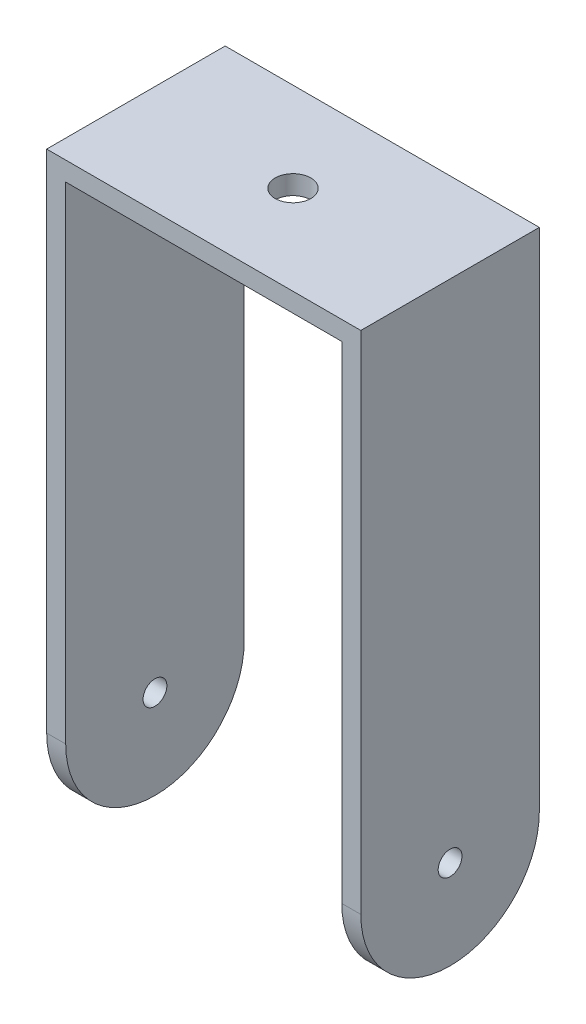
ISO-10303-21;
HEADER;
FILE_DESCRIPTION(('STEP AP214'),'2;1');
FILE_NAME('part.step','',(''),(''),'','','');
FILE_SCHEMA(('AUTOMOTIVE_DESIGN { 1 0 10303 214 1 1 1 1 }'));
ENDSEC;
DATA;
#1=APPLICATION_CONTEXT('core data for automotive mechanical design processes');
#2=APPLICATION_PROTOCOL_DEFINITION('international standard','automotive_design',2000,#1);
#3=PRODUCT_CONTEXT('',#1,'mechanical');
#4=PRODUCT('Part','Part','',(#3));
#5=PRODUCT_RELATED_PRODUCT_CATEGORY('part','',(#4));
#6=PRODUCT_DEFINITION_FORMATION('','',#4);
#7=PRODUCT_DEFINITION_CONTEXT('part definition',#1,'design');
#8=PRODUCT_DEFINITION('design','',#6,#7);
#9=PRODUCT_DEFINITION_SHAPE('','',#8);
#10=(LENGTH_UNIT() NAMED_UNIT(*) SI_UNIT(.MILLI.,.METRE.));
#11=(NAMED_UNIT(*) PLANE_ANGLE_UNIT() SI_UNIT($,.RADIAN.));
#12=(NAMED_UNIT(*) SI_UNIT($,.STERADIAN.) SOLID_ANGLE_UNIT());
#13=UNCERTAINTY_MEASURE_WITH_UNIT(LENGTH_MEASURE(1.E-05),#10,'distance_accuracy_value','');
#14=(GEOMETRIC_REPRESENTATION_CONTEXT(3) GLOBAL_UNCERTAINTY_ASSIGNED_CONTEXT((#13)) GLOBAL_UNIT_ASSIGNED_CONTEXT((#10,
#11,#12)) REPRESENTATION_CONTEXT('',''));
#15=CARTESIAN_POINT('',(0.,0.,0.));
#16=DIRECTION('',(0.,0.,1.));
#17=DIRECTION('',(1.,0.,0.));
#18=AXIS2_PLACEMENT_3D('',#15,#16,#17);
#19=CARTESIAN_POINT('',(0.,0.,75.));
#20=DIRECTION('',(1.,0.,0.));
#21=DIRECTION('',(0.,0.,-1.));
#22=AXIS2_PLACEMENT_3D('',#19,#20,#21);
#23=PLANE('',#22);
#24=CARTESIAN_POINT('',(0.,-212.5,37.5));
#25=DIRECTION('',(1.,0.,0.));
#26=DIRECTION('',(0.,0.,-1.));
#27=AXIS2_PLACEMENT_3D('',#24,#25,#26);
#28=CIRCLE('',#27,5.);
#29=CARTESIAN_POINT('',(0.,-212.5,32.5));
#30=VERTEX_POINT('',#29);
#31=EDGE_CURVE('E225',#30,#30,#28,.T.);
#32=ORIENTED_EDGE('',*,*,#31,.T.);
#33=EDGE_LOOP('',(#32));
#34=FACE_BOUND('',#33,.T.);
#35=CARTESIAN_POINT('',(0.,-212.5,37.5));
#36=DIRECTION('',(1.,0.,0.));
#37=DIRECTION('',(0.,0.,-1.));
#38=AXIS2_PLACEMENT_3D('',#35,#36,#37);
#39=CIRCLE('',#38,37.5);
#40=CARTESIAN_POINT('',(0.,-212.5,0.));
#41=VERTEX_POINT('',#40);
#42=CARTESIAN_POINT('',(0.,-250.,37.5));
#43=VERTEX_POINT('',#42);
#44=EDGE_CURVE('E50',#41,#43,#39,.F.);
#45=ORIENTED_EDGE('',*,*,#44,.T.);
#46=CARTESIAN_POINT('',(0.,-212.5,37.5));
#47=DIRECTION('',(1.,0.,0.));
#48=DIRECTION('',(0.,0.,-1.));
#49=AXIS2_PLACEMENT_3D('',#46,#47,#48);
#50=CIRCLE('',#49,37.5);
#51=CARTESIAN_POINT('',(0.,-212.5,75.));
#52=VERTEX_POINT('',#51);
#53=EDGE_CURVE('E182',#43,#52,#50,.F.);
#54=ORIENTED_EDGE('',*,*,#53,.T.);
#55=DIRECTION('',(0.,-1.,0.));
#56=VECTOR('',#55,1.);
#57=CARTESIAN_POINT('',(0.,0.,75.));
#58=LINE('',#57,#56);
#59=CARTESIAN_POINT('',(0.,0.,75.));
#60=VERTEX_POINT('',#59);
#61=EDGE_CURVE('E123',#60,#52,#58,.T.);
#62=ORIENTED_EDGE('',*,*,#61,.F.);
#63=DIRECTION('',(0.,0.,-1.));
#64=VECTOR('',#63,1.);
#65=CARTESIAN_POINT('',(0.,0.,75.));
#66=LINE('',#65,#64);
#67=CARTESIAN_POINT('',(0.,0.,0.));
#68=VERTEX_POINT('',#67);
#69=EDGE_CURVE('E145',#60,#68,#66,.T.);
#70=ORIENTED_EDGE('',*,*,#69,.T.);
#71=DIRECTION('',(0.,-1.,0.));
#72=VECTOR('',#71,1.);
#73=CARTESIAN_POINT('',(0.,0.,0.));
#74=LINE('',#73,#72);
#75=EDGE_CURVE('E146',#68,#41,#74,.T.);
#76=ORIENTED_EDGE('',*,*,#75,.T.);
#77=EDGE_LOOP('',(#45,#54,#62,#70,#76));
#78=FACE_BOUND('',#77,.T.);
#79=ADVANCED_FACE('F33',(#34,#78),#23,.F.);
#80=CARTESIAN_POINT('',(8.,-8.,75.));
#81=DIRECTION('',(-1.,0.,0.));
#82=DIRECTION('',(0.,-1.,0.));
#83=AXIS2_PLACEMENT_3D('',#80,#81,#82);
#84=PLANE('',#83);
#85=CARTESIAN_POINT('',(8.00000000000002,-212.5,37.5));
#86=DIRECTION('',(-1.,0.,0.));
#87=DIRECTION('',(0.,-1.,0.));
#88=AXIS2_PLACEMENT_3D('',#85,#86,#87);
#89=CIRCLE('',#88,5.);
#90=CARTESIAN_POINT('',(8.00000000000002,-217.5,37.5));
#91=VERTEX_POINT('',#90);
#92=EDGE_CURVE('E230',#91,#91,#89,.T.);
#93=ORIENTED_EDGE('',*,*,#92,.T.);
#94=EDGE_LOOP('',(#93));
#95=FACE_BOUND('',#94,.T.);
#96=DIRECTION('',(0.,1.,0.));
#97=VECTOR('',#96,1.);
#98=CARTESIAN_POINT('',(8.,-8.,75.));
#99=LINE('',#98,#97);
#100=CARTESIAN_POINT('',(8.00000000000002,-212.5,75.));
#101=VERTEX_POINT('',#100);
#102=CARTESIAN_POINT('',(8.,-8.,75.));
#103=VERTEX_POINT('',#102);
#104=EDGE_CURVE('E112',#101,#103,#99,.T.);
#105=ORIENTED_EDGE('',*,*,#104,.F.);
#106=CARTESIAN_POINT('',(8.00000000000002,-212.5,37.5));
#107=DIRECTION('',(-1.,0.,0.));
#108=DIRECTION('',(0.,-1.,0.));
#109=AXIS2_PLACEMENT_3D('',#106,#107,#108);
#110=CIRCLE('',#109,37.5);
#111=CARTESIAN_POINT('',(8.00000000000003,-250.,37.5));
#112=VERTEX_POINT('',#111);
#113=EDGE_CURVE('E179',#101,#112,#110,.F.);
#114=ORIENTED_EDGE('',*,*,#113,.T.);
#115=CARTESIAN_POINT('',(8.00000000000002,-212.5,37.5));
#116=DIRECTION('',(-1.,0.,0.));
#117=DIRECTION('',(0.,-1.,0.));
#118=AXIS2_PLACEMENT_3D('',#115,#116,#117);
#119=CIRCLE('',#118,37.5);
#120=CARTESIAN_POINT('',(8.00000000000002,-212.5,0.));
#121=VERTEX_POINT('',#120);
#122=EDGE_CURVE('E177',#112,#121,#119,.F.);
#123=ORIENTED_EDGE('',*,*,#122,.T.);
#124=DIRECTION('',(0.,1.,0.));
#125=VECTOR('',#124,1.);
#126=CARTESIAN_POINT('',(8.,-8.,0.));
#127=LINE('',#126,#125);
#128=CARTESIAN_POINT('',(8.,-8.,0.));
#129=VERTEX_POINT('',#128);
#130=EDGE_CURVE('E128',#121,#129,#127,.T.);
#131=ORIENTED_EDGE('',*,*,#130,.T.);
#132=DIRECTION('',(0.,0.,-1.));
#133=VECTOR('',#132,1.);
#134=CARTESIAN_POINT('',(8.,-8.,75.));
#135=LINE('',#134,#133);
#136=EDGE_CURVE('E126',#103,#129,#135,.T.);
#137=ORIENTED_EDGE('',*,*,#136,.F.);
#138=EDGE_LOOP('',(#105,#114,#123,#131,#137));
#139=FACE_BOUND('',#138,.T.);
#140=ADVANCED_FACE('F127',(#95,#139),#84,.F.);
#141=CARTESIAN_POINT('',(8.,-8.,75.));
#142=DIRECTION('',(0.,1.,0.));
#143=DIRECTION('',(0.,0.,1.));
#144=AXIS2_PLACEMENT_3D('',#141,#142,#143);
#145=PLANE('',#144);
#146=CARTESIAN_POINT('',(66.,-8.,37.5));
#147=DIRECTION('',(0.,1.,0.));
#148=DIRECTION('',(0.,0.,1.));
#149=AXIS2_PLACEMENT_3D('',#146,#147,#148);
#150=CIRCLE('',#149,7.50000000000001);
#151=CARTESIAN_POINT('',(66.,-8.,45.));
#152=VERTEX_POINT('',#151);
#153=EDGE_CURVE('E148',#152,#152,#150,.T.);
#154=ORIENTED_EDGE('',*,*,#153,.T.);
#155=EDGE_LOOP('',(#154));
#156=FACE_BOUND('',#155,.T.);
#157=DIRECTION('',(1.,0.,0.));
#158=VECTOR('',#157,1.);
#159=CARTESIAN_POINT('',(8.,-8.,0.));
#160=LINE('',#159,#158);
#161=CARTESIAN_POINT('',(124.,-8.,0.));
#162=VERTEX_POINT('',#161);
#163=EDGE_CURVE('E150',#129,#162,#160,.T.);
#164=ORIENTED_EDGE('',*,*,#163,.T.);
#165=DIRECTION('',(0.,0.,-1.));
#166=VECTOR('',#165,1.);
#167=CARTESIAN_POINT('',(124.,-8.,75.));
#168=LINE('',#167,#166);
#169=CARTESIAN_POINT('',(124.,-8.,75.));
#170=VERTEX_POINT('',#169);
#171=EDGE_CURVE('E131',#170,#162,#168,.T.);
#172=ORIENTED_EDGE('',*,*,#171,.F.);
#173=DIRECTION('',(1.,0.,0.));
#174=VECTOR('',#173,1.);
#175=CARTESIAN_POINT('',(8.,-8.,75.));
#176=LINE('',#175,#174);
#177=EDGE_CURVE('E117',#103,#170,#176,.T.);
#178=ORIENTED_EDGE('',*,*,#177,.F.);
#179=ORIENTED_EDGE('',*,*,#136,.T.);
#180=EDGE_LOOP('',(#164,#172,#178,#179));
#181=FACE_BOUND('',#180,.T.);
#182=ADVANCED_FACE('F133',(#156,#181),#145,.F.);
#183=CARTESIAN_POINT('',(124.,-8.,75.));
#184=DIRECTION('',(1.,0.,0.));
#185=DIRECTION('',(0.,1.,0.));
#186=AXIS2_PLACEMENT_3D('',#183,#184,#185);
#187=PLANE('',#186);
#188=CARTESIAN_POINT('',(124.,-212.5,37.5));
#189=DIRECTION('',(1.,0.,0.));
#190=DIRECTION('',(0.,1.,0.));
#191=AXIS2_PLACEMENT_3D('',#188,#189,#190);
#192=CIRCLE('',#191,5.);
#193=CARTESIAN_POINT('',(124.,-207.5,37.5));
#194=VERTEX_POINT('',#193);
#195=EDGE_CURVE('E191',#194,#194,#192,.T.);
#196=ORIENTED_EDGE('',*,*,#195,.T.);
#197=EDGE_LOOP('',(#196));
#198=FACE_BOUND('',#197,.T.);
#199=CARTESIAN_POINT('',(124.,-212.5,37.5));
#200=DIRECTION('',(1.,0.,0.));
#201=DIRECTION('',(0.,1.,0.));
#202=AXIS2_PLACEMENT_3D('',#199,#200,#201);
#203=CIRCLE('',#202,37.5);
#204=CARTESIAN_POINT('',(124.,-212.5,0.));
#205=VERTEX_POINT('',#204);
#206=CARTESIAN_POINT('',(124.,-250.,37.5));
#207=VERTEX_POINT('',#206);
#208=EDGE_CURVE('E173',#205,#207,#203,.F.);
#209=ORIENTED_EDGE('',*,*,#208,.T.);
#210=CARTESIAN_POINT('',(124.,-212.5,37.5));
#211=DIRECTION('',(1.,0.,0.));
#212=DIRECTION('',(0.,1.,0.));
#213=AXIS2_PLACEMENT_3D('',#210,#211,#212);
#214=CIRCLE('',#213,37.5);
#215=CARTESIAN_POINT('',(124.,-212.5,75.));
#216=VERTEX_POINT('',#215);
#217=EDGE_CURVE('E175',#207,#216,#214,.F.);
#218=ORIENTED_EDGE('',*,*,#217,.T.);
#219=DIRECTION('',(0.,-1.,0.));
#220=VECTOR('',#219,1.);
#221=CARTESIAN_POINT('',(124.,-8.,75.));
#222=LINE('',#221,#220);
#223=EDGE_CURVE('E136',#170,#216,#222,.T.);
#224=ORIENTED_EDGE('',*,*,#223,.F.);
#225=ORIENTED_EDGE('',*,*,#171,.T.);
#226=DIRECTION('',(0.,-1.,0.));
#227=VECTOR('',#226,1.);
#228=CARTESIAN_POINT('',(124.,-8.,0.));
#229=LINE('',#228,#227);
#230=EDGE_CURVE('E152',#162,#205,#229,.T.);
#231=ORIENTED_EDGE('',*,*,#230,.T.);
#232=EDGE_LOOP('',(#209,#218,#224,#225,#231));
#233=FACE_BOUND('',#232,.T.);
#234=ADVANCED_FACE('F202',(#198,#233),#187,.F.);
#235=CARTESIAN_POINT('',(132.,0.,75.));
#236=DIRECTION('',(-1.,0.,0.));
#237=DIRECTION('',(0.,-1.,0.));
#238=AXIS2_PLACEMENT_3D('',#235,#236,#237);
#239=PLANE('',#238);
#240=CARTESIAN_POINT('',(132.,-212.5,37.5));
#241=DIRECTION('',(1.,0.,0.));
#242=DIRECTION('',(0.,1.,0.));
#243=AXIS2_PLACEMENT_3D('',#240,#241,#242);
#244=CIRCLE('',#243,5.);
#245=CARTESIAN_POINT('',(132.,-207.5,37.5));
#246=VERTEX_POINT('',#245);
#247=EDGE_CURVE('E186',#246,#246,#244,.T.);
#248=ORIENTED_EDGE('',*,*,#247,.F.);
#249=EDGE_LOOP('',(#248));
#250=FACE_BOUND('',#249,.T.);
#251=DIRECTION('',(0.,1.,0.));
#252=VECTOR('',#251,1.);
#253=CARTESIAN_POINT('',(132.,0.,75.));
#254=LINE('',#253,#252);
#255=CARTESIAN_POINT('',(132.,-212.5,75.));
#256=VERTEX_POINT('',#255);
#257=CARTESIAN_POINT('',(132.,0.,75.));
#258=VERTEX_POINT('',#257);
#259=EDGE_CURVE('E138',#256,#258,#254,.T.);
#260=ORIENTED_EDGE('',*,*,#259,.F.);
#261=CARTESIAN_POINT('',(132.,-212.5,37.5));
#262=DIRECTION('',(-1.,0.,0.));
#263=DIRECTION('',(0.,-1.,0.));
#264=AXIS2_PLACEMENT_3D('',#261,#262,#263);
#265=CIRCLE('',#264,37.5);
#266=CARTESIAN_POINT('',(132.,-250.,37.5));
#267=VERTEX_POINT('',#266);
#268=EDGE_CURVE('E171',#256,#267,#265,.F.);
#269=ORIENTED_EDGE('',*,*,#268,.T.);
#270=CARTESIAN_POINT('',(132.,-212.5,37.5));
#271=DIRECTION('',(-1.,0.,0.));
#272=DIRECTION('',(0.,-1.,0.));
#273=AXIS2_PLACEMENT_3D('',#270,#271,#272);
#274=CIRCLE('',#273,37.5);
#275=CARTESIAN_POINT('',(132.,-212.5,0.));
#276=VERTEX_POINT('',#275);
#277=EDGE_CURVE('E169',#267,#276,#274,.F.);
#278=ORIENTED_EDGE('',*,*,#277,.T.);
#279=DIRECTION('',(0.,1.,0.));
#280=VECTOR('',#279,1.);
#281=CARTESIAN_POINT('',(132.,0.,0.));
#282=LINE('',#281,#280);
#283=CARTESIAN_POINT('',(132.,0.,0.));
#284=VERTEX_POINT('',#283);
#285=EDGE_CURVE('E155',#276,#284,#282,.T.);
#286=ORIENTED_EDGE('',*,*,#285,.T.);
#287=DIRECTION('',(0.,0.,-1.));
#288=VECTOR('',#287,1.);
#289=CARTESIAN_POINT('',(132.,0.,75.));
#290=LINE('',#289,#288);
#291=EDGE_CURVE('E161',#258,#284,#290,.T.);
#292=ORIENTED_EDGE('',*,*,#291,.F.);
#293=EDGE_LOOP('',(#260,#269,#278,#286,#292));
#294=FACE_BOUND('',#293,.T.);
#295=ADVANCED_FACE('F209',(#250,#294),#239,.F.);
#296=CARTESIAN_POINT('',(0.,0.,75.));
#297=DIRECTION('',(0.,-1.,0.));
#298=DIRECTION('',(0.,0.,-1.));
#299=AXIS2_PLACEMENT_3D('',#296,#297,#298);
#300=PLANE('',#299);
#301=CARTESIAN_POINT('',(66.,0.,37.5));
#302=DIRECTION('',(0.,1.,0.));
#303=DIRECTION('',(0.,0.,1.));
#304=AXIS2_PLACEMENT_3D('',#301,#302,#303);
#305=CIRCLE('',#304,7.50000000000001);
#306=CARTESIAN_POINT('',(66.,0.,45.));
#307=VERTEX_POINT('',#306);
#308=EDGE_CURVE('E222',#307,#307,#305,.T.);
#309=ORIENTED_EDGE('',*,*,#308,.F.);
#310=EDGE_LOOP('',(#309));
#311=FACE_BOUND('',#310,.T.);
#312=DIRECTION('',(-1.,0.,0.));
#313=VECTOR('',#312,1.);
#314=CARTESIAN_POINT('',(0.,0.,0.));
#315=LINE('',#314,#313);
#316=EDGE_CURVE('E157',#284,#68,#315,.T.);
#317=ORIENTED_EDGE('',*,*,#316,.T.);
#318=ORIENTED_EDGE('',*,*,#69,.F.);
#319=DIRECTION('',(-1.,0.,0.));
#320=VECTOR('',#319,1.);
#321=CARTESIAN_POINT('',(0.,0.,75.));
#322=LINE('',#321,#320);
#323=EDGE_CURVE('E143',#258,#60,#322,.T.);
#324=ORIENTED_EDGE('',*,*,#323,.F.);
#325=ORIENTED_EDGE('',*,*,#291,.T.);
#326=EDGE_LOOP('',(#317,#318,#324,#325));
#327=FACE_BOUND('',#326,.T.);
#328=ADVANCED_FACE('F218',(#311,#327),#300,.F.);
#329=CARTESIAN_POINT('',(0.,0.,75.));
#330=DIRECTION('',(0.,0.,1.));
#331=DIRECTION('',(1.,0.,0.));
#332=AXIS2_PLACEMENT_3D('',#329,#330,#331);
#333=PLANE('',#332);
#334=ORIENTED_EDGE('',*,*,#223,.T.);
#335=DIRECTION('',(1.,0.,0.));
#336=VECTOR('',#335,1.);
#337=CARTESIAN_POINT('',(132.,-212.5,75.));
#338=LINE('',#337,#336);
#339=EDGE_CURVE('E166',#216,#256,#338,.T.);
#340=ORIENTED_EDGE('',*,*,#339,.T.);
#341=ORIENTED_EDGE('',*,*,#259,.T.);
#342=ORIENTED_EDGE('',*,*,#323,.T.);
#343=ORIENTED_EDGE('',*,*,#61,.T.);
#344=DIRECTION('',(1.,0.,0.));
#345=VECTOR('',#344,1.);
#346=CARTESIAN_POINT('',(8.00000000000003,-212.5,75.));
#347=LINE('',#346,#345);
#348=EDGE_CURVE('E121',#52,#101,#347,.T.);
#349=ORIENTED_EDGE('',*,*,#348,.T.);
#350=ORIENTED_EDGE('',*,*,#104,.T.);
#351=ORIENTED_EDGE('',*,*,#177,.T.);
#352=EDGE_LOOP('',(#334,#340,#341,#342,#343,#349,#350,#351));
#353=FACE_BOUND('',#352,.T.);
#354=ADVANCED_FACE('F115',(#353),#333,.T.);
#355=CARTESIAN_POINT('',(0.,0.,0.));
#356=DIRECTION('',(0.,0.,1.));
#357=DIRECTION('',(1.,0.,0.));
#358=AXIS2_PLACEMENT_3D('',#355,#356,#357);
#359=PLANE('',#358);
#360=ORIENTED_EDGE('',*,*,#130,.F.);
#361=DIRECTION('',(1.,0.,0.));
#362=VECTOR('',#361,1.);
#363=CARTESIAN_POINT('',(0.,-212.5,0.));
#364=LINE('',#363,#362);
#365=EDGE_CURVE('E11',#121,#41,#364,.F.);
#366=ORIENTED_EDGE('',*,*,#365,.T.);
#367=ORIENTED_EDGE('',*,*,#75,.F.);
#368=ORIENTED_EDGE('',*,*,#316,.F.);
#369=ORIENTED_EDGE('',*,*,#285,.F.);
#370=DIRECTION('',(1.,0.,0.));
#371=VECTOR('',#370,1.);
#372=CARTESIAN_POINT('',(0.,-212.5,0.));
#373=LINE('',#372,#371);
#374=EDGE_CURVE('E42',#276,#205,#373,.F.);
#375=ORIENTED_EDGE('',*,*,#374,.T.);
#376=ORIENTED_EDGE('',*,*,#230,.F.);
#377=ORIENTED_EDGE('',*,*,#163,.F.);
#378=EDGE_LOOP('',(#360,#366,#367,#368,#369,#375,#376,#377));
#379=FACE_BOUND('',#378,.T.);
#380=ADVANCED_FACE('F199',(#379),#359,.F.);
#381=CARTESIAN_POINT('',(66.,-8.,37.5));
#382=DIRECTION('',(0.,1.,0.));
#383=DIRECTION('',(0.,0.,1.));
#384=AXIS2_PLACEMENT_3D('',#381,#382,#383);
#385=CYLINDRICAL_SURFACE('',#384,7.50000000000001);
#386=ORIENTED_EDGE('',*,*,#153,.F.);
#387=EDGE_LOOP('',(#386));
#388=FACE_BOUND('',#387,.T.);
#389=ORIENTED_EDGE('',*,*,#308,.T.);
#390=EDGE_LOOP('',(#389));
#391=FACE_BOUND('',#390,.T.);
#392=ADVANCED_FACE('F240',(#388,#391),#385,.F.);
#393=CARTESIAN_POINT('',(-1.99999999999995,-212.5,37.5));
#394=DIRECTION('',(1.,0.,0.));
#395=DIRECTION('',(0.,1.,0.));
#396=AXIS2_PLACEMENT_3D('',#393,#394,#395);
#397=CYLINDRICAL_SURFACE('',#396,5.);
#398=ORIENTED_EDGE('',*,*,#247,.T.);
#399=EDGE_LOOP('',(#398));
#400=FACE_BOUND('',#399,.T.);
#401=ORIENTED_EDGE('',*,*,#195,.F.);
#402=EDGE_LOOP('',(#401));
#403=FACE_BOUND('',#402,.T.);
#404=ADVANCED_FACE('F237',(#400,#403),#397,.F.);
#405=ORIENTED_EDGE('',*,*,#92,.F.);
#406=EDGE_LOOP('',(#405));
#407=FACE_BOUND('',#406,.T.);
#408=ORIENTED_EDGE('',*,*,#31,.F.);
#409=EDGE_LOOP('',(#408));
#410=FACE_BOUND('',#409,.T.);
#411=ADVANCED_FACE('F239',(#407,#410),#397,.F.);
#412=CARTESIAN_POINT('',(124.,-212.5,37.5));
#413=DIRECTION('',(1.,0.,0.));
#414=DIRECTION('',(0.,0.,-1.));
#415=AXIS2_PLACEMENT_3D('',#412,#413,#414);
#416=CYLINDRICAL_SURFACE('',#415,37.5);
#417=DIRECTION('',(1.,0.,0.));
#418=VECTOR('',#417,1.);
#419=CARTESIAN_POINT('',(124.,-250.,37.5));
#420=LINE('',#419,#418);
#421=EDGE_CURVE('E184',#207,#267,#420,.T.);
#422=ORIENTED_EDGE('',*,*,#421,.F.);
#423=ORIENTED_EDGE('',*,*,#208,.F.);
#424=ORIENTED_EDGE('',*,*,#374,.F.);
#425=ORIENTED_EDGE('',*,*,#277,.F.);
#426=EDGE_LOOP('',(#422,#423,#424,#425));
#427=FACE_BOUND('',#426,.T.);
#428=ADVANCED_FACE('F214',(#427),#416,.T.);
#429=CARTESIAN_POINT('',(0.,-212.5,37.5));
#430=DIRECTION('',(-1.,0.,0.));
#431=DIRECTION('',(0.,0.,1.));
#432=AXIS2_PLACEMENT_3D('',#429,#430,#431);
#433=CYLINDRICAL_SURFACE('',#432,37.5);
#434=ORIENTED_EDGE('',*,*,#217,.F.);
#435=ORIENTED_EDGE('',*,*,#421,.T.);
#436=ORIENTED_EDGE('',*,*,#268,.F.);
#437=ORIENTED_EDGE('',*,*,#339,.F.);
#438=EDGE_LOOP('',(#434,#435,#436,#437));
#439=FACE_BOUND('',#438,.T.);
#440=ADVANCED_FACE('F206',(#439),#433,.T.);
#441=CARTESIAN_POINT('',(0.,-212.5,37.5));
#442=DIRECTION('',(1.,0.,0.));
#443=DIRECTION('',(0.,0.,-1.));
#444=AXIS2_PLACEMENT_3D('',#441,#442,#443);
#445=CYLINDRICAL_SURFACE('',#444,37.5);
#446=DIRECTION('',(1.,0.,0.));
#447=VECTOR('',#446,1.);
#448=CARTESIAN_POINT('',(0.,-250.,37.5));
#449=LINE('',#448,#447);
#450=EDGE_CURVE('E37',#43,#112,#449,.T.);
#451=ORIENTED_EDGE('',*,*,#450,.F.);
#452=ORIENTED_EDGE('',*,*,#44,.F.);
#453=ORIENTED_EDGE('',*,*,#365,.F.);
#454=ORIENTED_EDGE('',*,*,#122,.F.);
#455=EDGE_LOOP('',(#451,#452,#453,#454));
#456=FACE_BOUND('',#455,.T.);
#457=ADVANCED_FACE('F35',(#456),#445,.T.);
#458=CARTESIAN_POINT('',(0.,-212.5,37.5));
#459=DIRECTION('',(-1.,0.,0.));
#460=DIRECTION('',(0.,0.,1.));
#461=AXIS2_PLACEMENT_3D('',#458,#459,#460);
#462=CYLINDRICAL_SURFACE('',#461,37.5);
#463=ORIENTED_EDGE('',*,*,#53,.F.);
#464=ORIENTED_EDGE('',*,*,#450,.T.);
#465=ORIENTED_EDGE('',*,*,#113,.F.);
#466=ORIENTED_EDGE('',*,*,#348,.F.);
#467=EDGE_LOOP('',(#463,#464,#465,#466));
#468=FACE_BOUND('',#467,.T.);
#469=ADVANCED_FACE('F196',(#468),#462,.T.);
#470=CLOSED_SHELL('',(#79,#140,#182,#234,#295,#328,#354,#380,#392,#404,#411,#428,#440,#457,#469));
#471=MANIFOLD_SOLID_BREP('B2',#470);
#472=ADVANCED_BREP_SHAPE_REPRESENTATION('',(#18,#471),#14);
#473=SHAPE_DEFINITION_REPRESENTATION(#9,#472);
ENDSEC;
END-ISO-10303-21;
